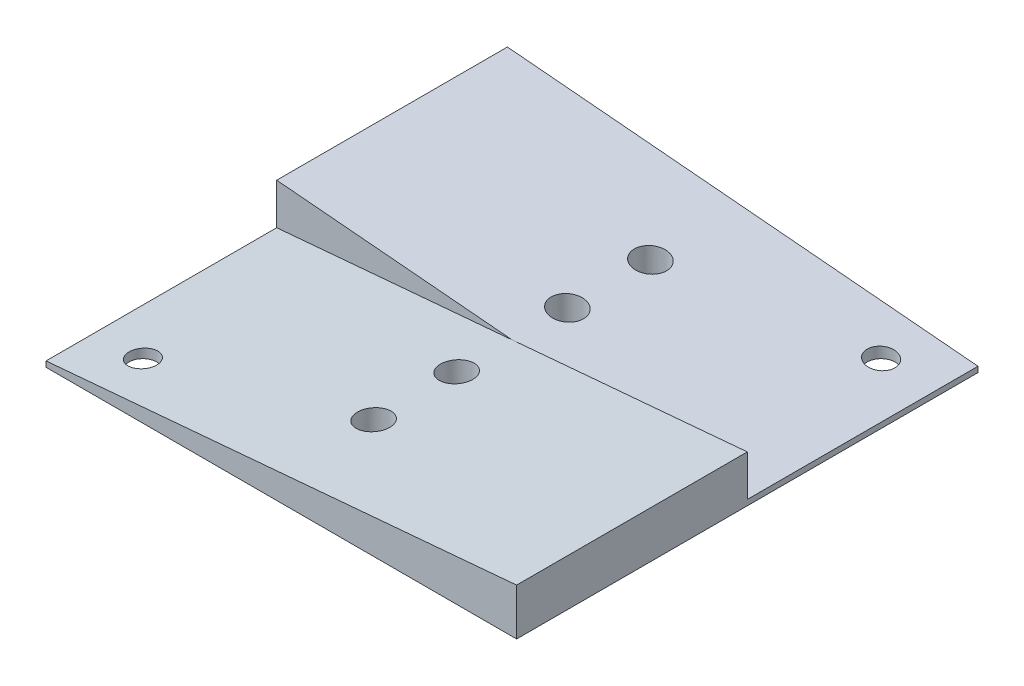
ISO-10303-21;
HEADER;
FILE_DESCRIPTION(('STEP AP214'),'2;1');
FILE_NAME('part.step','',(''),(''),'','','');
FILE_SCHEMA(('AUTOMOTIVE_DESIGN { 1 0 10303 214 1 1 1 1 }'));
ENDSEC;
DATA;
#1=APPLICATION_CONTEXT('core data for automotive mechanical design processes');
#2=APPLICATION_PROTOCOL_DEFINITION('international standard','automotive_design',2000,#1);
#3=PRODUCT_CONTEXT('',#1,'mechanical');
#4=PRODUCT('Part','Part','',(#3));
#5=PRODUCT_RELATED_PRODUCT_CATEGORY('part','',(#4));
#6=PRODUCT_DEFINITION_FORMATION('','',#4);
#7=PRODUCT_DEFINITION_CONTEXT('part definition',#1,'design');
#8=PRODUCT_DEFINITION('design','',#6,#7);
#9=PRODUCT_DEFINITION_SHAPE('','',#8);
#10=(LENGTH_UNIT() NAMED_UNIT(*) SI_UNIT(.MILLI.,.METRE.));
#11=(NAMED_UNIT(*) PLANE_ANGLE_UNIT() SI_UNIT($,.RADIAN.));
#12=(NAMED_UNIT(*) SI_UNIT($,.STERADIAN.) SOLID_ANGLE_UNIT());
#13=UNCERTAINTY_MEASURE_WITH_UNIT(LENGTH_MEASURE(1.E-05),#10,'distance_accuracy_value','');
#14=(GEOMETRIC_REPRESENTATION_CONTEXT(3) GLOBAL_UNCERTAINTY_ASSIGNED_CONTEXT((#13)) GLOBAL_UNIT_ASSIGNED_CONTEXT((#10,
#11,#12)) REPRESENTATION_CONTEXT('',''));
#15=CARTESIAN_POINT('',(0.,0.,0.));
#16=DIRECTION('',(0.,0.,1.));
#17=DIRECTION('',(1.,0.,0.));
#18=AXIS2_PLACEMENT_3D('',#15,#16,#17);
#19=CARTESIAN_POINT('',(-25.5,6.,-25.));
#20=DIRECTION('',(1.,0.,0.));
#21=DIRECTION('',(0.,0.,-1.));
#22=AXIS2_PLACEMENT_3D('',#19,#20,#21);
#23=PLANE('',#22);
#24=DIRECTION('',(0.,-1.,0.));
#25=VECTOR('',#24,1.);
#26=CARTESIAN_POINT('',(-25.5,0.6,0.));
#27=LINE('',#26,#25);
#28=CARTESIAN_POINT('',(-25.5,5.06192183982213,0.));
#29=VERTEX_POINT('',#28);
#30=CARTESIAN_POINT('',(-25.5,0.6,0.));
#31=VERTEX_POINT('',#30);
#32=EDGE_CURVE('E119',#29,#31,#27,.T.);
#33=ORIENTED_EDGE('',*,*,#32,.F.);
#34=DIRECTION('',(0.,0.,-1.));
#35=VECTOR('',#34,1.);
#36=CARTESIAN_POINT('',(-25.5,5.06192183982213,0.));
#37=LINE('',#36,#35);
#38=CARTESIAN_POINT('',(-25.5,5.06192183982213,-25.));
#39=VERTEX_POINT('',#38);
#40=EDGE_CURVE('E53',#29,#39,#37,.T.);
#41=ORIENTED_EDGE('',*,*,#40,.T.);
#42=DIRECTION('',(0.,-1.,0.));
#43=VECTOR('',#42,1.);
#44=CARTESIAN_POINT('',(-25.5,6.,-25.));
#45=LINE('',#44,#43);
#46=CARTESIAN_POINT('',(-25.5,0.,-25.));
#47=VERTEX_POINT('',#46);
#48=EDGE_CURVE('E59',#39,#47,#45,.T.);
#49=ORIENTED_EDGE('',*,*,#48,.T.);
#50=DIRECTION('',(0.,0.,1.));
#51=VECTOR('',#50,1.);
#52=CARTESIAN_POINT('',(-25.5,0.,-25.));
#53=LINE('',#52,#51);
#54=CARTESIAN_POINT('',(-25.5,0.,25.));
#55=VERTEX_POINT('',#54);
#56=EDGE_CURVE('E128',#47,#55,#53,.T.);
#57=ORIENTED_EDGE('',*,*,#56,.T.);
#58=DIRECTION('',(0.,-1.,0.));
#59=VECTOR('',#58,1.);
#60=CARTESIAN_POINT('',(-25.5,6.,25.));
#61=LINE('',#60,#59);
#62=CARTESIAN_POINT('',(-25.5,0.6,25.));
#63=VERTEX_POINT('',#62);
#64=EDGE_CURVE('E45',#63,#55,#61,.T.);
#65=ORIENTED_EDGE('',*,*,#64,.F.);
#66=DIRECTION('',(0.,0.,1.));
#67=VECTOR('',#66,1.);
#68=CARTESIAN_POINT('',(-25.5,0.6,0.));
#69=LINE('',#68,#67);
#70=EDGE_CURVE('E124',#31,#63,#69,.T.);
#71=ORIENTED_EDGE('',*,*,#70,.F.);
#72=EDGE_LOOP('',(#33,#41,#49,#57,#65,#71));
#73=FACE_BOUND('',#72,.T.);
#74=ADVANCED_FACE('F37',(#73),#23,.F.);
#75=CARTESIAN_POINT('',(25.5,6.,25.));
#76=DIRECTION('',(0.,0.,-1.));
#77=DIRECTION('',(-1.,0.,0.));
#78=AXIS2_PLACEMENT_3D('',#75,#76,#77);
#79=PLANE('',#78);
#80=DIRECTION('',(0.,-1.,0.));
#81=VECTOR('',#80,1.);
#82=CARTESIAN_POINT('',(25.5,6.,25.));
#83=LINE('',#82,#81);
#84=CARTESIAN_POINT('',(25.5,5.06192183982213,25.));
#85=VERTEX_POINT('',#84);
#86=CARTESIAN_POINT('',(25.5,0.,25.));
#87=VERTEX_POINT('',#86);
#88=EDGE_CURVE('E140',#85,#87,#83,.T.);
#89=ORIENTED_EDGE('',*,*,#88,.F.);
#90=DIRECTION('',(0.996194698091746,0.0871557427476583,0.));
#91=VECTOR('',#90,1.);
#92=CARTESIAN_POINT('',(-25.5,0.6,25.));
#93=LINE('',#92,#91);
#94=EDGE_CURVE('E115',#63,#85,#93,.T.);
#95=ORIENTED_EDGE('',*,*,#94,.F.);
#96=ORIENTED_EDGE('',*,*,#64,.T.);
#97=DIRECTION('',(1.,0.,0.));
#98=VECTOR('',#97,1.);
#99=CARTESIAN_POINT('',(25.5,0.,25.));
#100=LINE('',#99,#98);
#101=EDGE_CURVE('E131',#55,#87,#100,.T.);
#102=ORIENTED_EDGE('',*,*,#101,.T.);
#103=EDGE_LOOP('',(#89,#95,#96,#102));
#104=FACE_BOUND('',#103,.T.);
#105=ADVANCED_FACE('F193',(#104),#79,.F.);
#106=CARTESIAN_POINT('',(25.5,6.,-25.));
#107=DIRECTION('',(-1.,0.,0.));
#108=DIRECTION('',(0.,0.,1.));
#109=AXIS2_PLACEMENT_3D('',#106,#107,#108);
#110=PLANE('',#109);
#111=DIRECTION('',(0.,-1.,0.));
#112=VECTOR('',#111,1.);
#113=CARTESIAN_POINT('',(25.5,6.,-25.));
#114=LINE('',#113,#112);
#115=CARTESIAN_POINT('',(25.5,0.6,-25.));
#116=VERTEX_POINT('',#115);
#117=CARTESIAN_POINT('',(25.5,0.,-25.));
#118=VERTEX_POINT('',#117);
#119=EDGE_CURVE('E113',#116,#118,#114,.T.);
#120=ORIENTED_EDGE('',*,*,#119,.F.);
#121=DIRECTION('',(0.,0.,-1.));
#122=VECTOR('',#121,1.);
#123=CARTESIAN_POINT('',(25.5,0.6,0.));
#124=LINE('',#123,#122);
#125=CARTESIAN_POINT('',(25.5,0.6,0.));
#126=VERTEX_POINT('',#125);
#127=EDGE_CURVE('E107',#126,#116,#124,.T.);
#128=ORIENTED_EDGE('',*,*,#127,.F.);
#129=DIRECTION('',(0.,-1.,0.));
#130=VECTOR('',#129,1.);
#131=CARTESIAN_POINT('',(25.5,0.6,0.));
#132=LINE('',#131,#130);
#133=CARTESIAN_POINT('',(25.5,5.06192183982213,0.));
#134=VERTEX_POINT('',#133);
#135=EDGE_CURVE('E94',#134,#126,#132,.T.);
#136=ORIENTED_EDGE('',*,*,#135,.F.);
#137=DIRECTION('',(0.,0.,1.));
#138=VECTOR('',#137,1.);
#139=CARTESIAN_POINT('',(25.5,5.06192183982213,0.));
#140=LINE('',#139,#138);
#141=EDGE_CURVE('E126',#134,#85,#140,.T.);
#142=ORIENTED_EDGE('',*,*,#141,.T.);
#143=ORIENTED_EDGE('',*,*,#88,.T.);
#144=DIRECTION('',(0.,0.,-1.));
#145=VECTOR('',#144,1.);
#146=CARTESIAN_POINT('',(25.5,0.,-25.));
#147=LINE('',#146,#145);
#148=EDGE_CURVE('E134',#87,#118,#147,.T.);
#149=ORIENTED_EDGE('',*,*,#148,.T.);
#150=EDGE_LOOP('',(#120,#128,#136,#142,#143,#149));
#151=FACE_BOUND('',#150,.T.);
#152=ADVANCED_FACE('F111',(#151),#110,.F.);
#153=CARTESIAN_POINT('',(25.5,6.,-25.));
#154=DIRECTION('',(0.,0.,1.));
#155=DIRECTION('',(1.,0.,0.));
#156=AXIS2_PLACEMENT_3D('',#153,#154,#155);
#157=PLANE('',#156);
#158=ORIENTED_EDGE('',*,*,#48,.F.);
#159=DIRECTION('',(-0.996194698091746,0.0871557427476583,0.));
#160=VECTOR('',#159,1.);
#161=CARTESIAN_POINT('',(25.5,0.6,-25.));
#162=LINE('',#161,#160);
#163=EDGE_CURVE('E104',#116,#39,#162,.T.);
#164=ORIENTED_EDGE('',*,*,#163,.F.);
#165=ORIENTED_EDGE('',*,*,#119,.T.);
#166=DIRECTION('',(-1.,0.,0.));
#167=VECTOR('',#166,1.);
#168=CARTESIAN_POINT('',(25.5,0.,-25.));
#169=LINE('',#168,#167);
#170=EDGE_CURVE('E136',#118,#47,#169,.T.);
#171=ORIENTED_EDGE('',*,*,#170,.T.);
#172=EDGE_LOOP('',(#158,#164,#165,#171));
#173=FACE_BOUND('',#172,.T.);
#174=ADVANCED_FACE('F182',(#173),#157,.F.);
#175=CARTESIAN_POINT('',(0.,0.,0.));
#176=DIRECTION('',(0.,-1.,0.));
#177=DIRECTION('',(0.,0.,-1.));
#178=AXIS2_PLACEMENT_3D('',#175,#176,#177);
#179=PLANE('',#178);
#180=CARTESIAN_POINT('',(-20.,0.,20.));
#181=DIRECTION('',(0.,-1.,0.));
#182=DIRECTION('',(0.,0.,-1.));
#183=AXIS2_PLACEMENT_3D('',#180,#181,#182);
#184=CIRCLE('',#183,1.5);
#185=CARTESIAN_POINT('',(-20.,0.,18.5));
#186=VERTEX_POINT('',#185);
#187=EDGE_CURVE('E157',#186,#186,#184,.T.);
#188=ORIENTED_EDGE('',*,*,#187,.F.);
#189=EDGE_LOOP('',(#188));
#190=FACE_BOUND('',#189,.T.);
#191=CARTESIAN_POINT('',(20.,0.,-20.));
#192=DIRECTION('',(0.,-1.,0.));
#193=DIRECTION('',(0.,0.,-1.));
#194=AXIS2_PLACEMENT_3D('',#191,#192,#193);
#195=CIRCLE('',#194,1.5);
#196=CARTESIAN_POINT('',(20.,0.,-21.5));
#197=VERTEX_POINT('',#196);
#198=EDGE_CURVE('E163',#197,#197,#195,.T.);
#199=ORIENTED_EDGE('',*,*,#198,.F.);
#200=EDGE_LOOP('',(#199));
#201=FACE_BOUND('',#200,.T.);
#202=CARTESIAN_POINT('',(0.,0.,15.));
#203=DIRECTION('',(0.,-1.,0.));
#204=DIRECTION('',(0.,0.,-1.));
#205=AXIS2_PLACEMENT_3D('',#202,#203,#204);
#206=CIRCLE('',#205,1.75);
#207=CARTESIAN_POINT('',(0.,0.,13.25));
#208=VERTEX_POINT('',#207);
#209=EDGE_CURVE('E173',#208,#208,#206,.T.);
#210=ORIENTED_EDGE('',*,*,#209,.F.);
#211=EDGE_LOOP('',(#210));
#212=FACE_BOUND('',#211,.T.);
#213=CARTESIAN_POINT('',(0.,0.,-15.));
#214=DIRECTION('',(0.,-1.,0.));
#215=DIRECTION('',(0.,0.,-1.));
#216=AXIS2_PLACEMENT_3D('',#213,#214,#215);
#217=CIRCLE('',#216,1.75);
#218=CARTESIAN_POINT('',(0.,0.,-16.75));
#219=VERTEX_POINT('',#218);
#220=EDGE_CURVE('E172',#219,#219,#217,.T.);
#221=ORIENTED_EDGE('',*,*,#220,.F.);
#222=EDGE_LOOP('',(#221));
#223=FACE_BOUND('',#222,.T.);
#224=CARTESIAN_POINT('',(0.,0.,-6.));
#225=DIRECTION('',(0.,-1.,0.));
#226=DIRECTION('',(0.,0.,-1.));
#227=AXIS2_PLACEMENT_3D('',#224,#225,#226);
#228=CIRCLE('',#227,1.75);
#229=CARTESIAN_POINT('',(0.,0.,-7.75));
#230=VERTEX_POINT('',#229);
#231=EDGE_CURVE('E161',#230,#230,#228,.T.);
#232=ORIENTED_EDGE('',*,*,#231,.F.);
#233=EDGE_LOOP('',(#232));
#234=FACE_BOUND('',#233,.T.);
#235=CARTESIAN_POINT('',(0.,0.,6.));
#236=DIRECTION('',(0.,-1.,0.));
#237=DIRECTION('',(0.,0.,-1.));
#238=AXIS2_PLACEMENT_3D('',#235,#236,#237);
#239=CIRCLE('',#238,1.75);
#240=CARTESIAN_POINT('',(0.,0.,4.25));
#241=VERTEX_POINT('',#240);
#242=EDGE_CURVE('E147',#241,#241,#239,.T.);
#243=ORIENTED_EDGE('',*,*,#242,.F.);
#244=EDGE_LOOP('',(#243));
#245=FACE_BOUND('',#244,.T.);
#246=ORIENTED_EDGE('',*,*,#56,.F.);
#247=ORIENTED_EDGE('',*,*,#170,.F.);
#248=ORIENTED_EDGE('',*,*,#148,.F.);
#249=ORIENTED_EDGE('',*,*,#101,.F.);
#250=EDGE_LOOP('',(#246,#247,#248,#249));
#251=FACE_BOUND('',#250,.T.);
#252=ADVANCED_FACE('F188',(#190,#201,#212,#223,#234,#245,#251),#179,.T.);
#253=CARTESIAN_POINT('',(-25.5,0.6,0.));
#254=DIRECTION('',(0.0871557427476583,-0.996194698091746,0.));
#255=DIRECTION('',(0.996194698091746,0.0871557427476583,0.));
#256=AXIS2_PLACEMENT_3D('',#253,#254,#255);
#257=PLANE('',#256);
#258=CARTESIAN_POINT('',(-20.,1.08118764939258,20.));
#259=DIRECTION('',(0.0871557427476583,-0.996194698091746,0.));
#260=DIRECTION('',(-0.996194698091746,-0.0871557427476583,0.));
#261=AXIS2_PLACEMENT_3D('',#258,#259,#260);
#262=ELLIPSE('',#261,1.50572975631502,1.5);
#263=CARTESIAN_POINT('',(-21.5,0.949954654103696,20.));
#264=VERTEX_POINT('',#263);
#265=EDGE_CURVE('E40',#264,#264,#262,.T.);
#266=ORIENTED_EDGE('',*,*,#265,.T.);
#267=EDGE_LOOP('',(#266));
#268=FACE_BOUND('',#267,.T.);
#269=CARTESIAN_POINT('',(0.,2.83096091991106,15.));
#270=DIRECTION('',(0.0871557427476583,-0.996194698091746,0.));
#271=DIRECTION('',(-0.996194698091746,-0.0871557427476583,0.));
#272=AXIS2_PLACEMENT_3D('',#269,#270,#271);
#273=ELLIPSE('',#272,1.75668471570086,1.75);
#274=CARTESIAN_POINT('',(-1.75,2.6778557587407,15.));
#275=VERTEX_POINT('',#274);
#276=EDGE_CURVE('E153',#275,#275,#273,.T.);
#277=ORIENTED_EDGE('',*,*,#276,.T.);
#278=EDGE_LOOP('',(#277));
#279=FACE_BOUND('',#278,.T.);
#280=CARTESIAN_POINT('',(0.,2.83096091991106,6.));
#281=DIRECTION('',(0.0871557427476583,-0.996194698091746,0.));
#282=DIRECTION('',(-0.996194698091746,-0.0871557427476583,0.));
#283=AXIS2_PLACEMENT_3D('',#280,#281,#282);
#284=ELLIPSE('',#283,1.75668471570086,1.75);
#285=CARTESIAN_POINT('',(-1.75,2.6778557587407,6.));
#286=VERTEX_POINT('',#285);
#287=EDGE_CURVE('E150',#286,#286,#284,.T.);
#288=ORIENTED_EDGE('',*,*,#287,.T.);
#289=EDGE_LOOP('',(#288));
#290=FACE_BOUND('',#289,.T.);
#291=ORIENTED_EDGE('',*,*,#94,.T.);
#292=ORIENTED_EDGE('',*,*,#141,.F.);
#293=DIRECTION('',(0.996194698091746,0.0871557427476583,0.));
#294=VECTOR('',#293,1.);
#295=CARTESIAN_POINT('',(-25.5,0.6,0.));
#296=LINE('',#295,#294);
#297=CARTESIAN_POINT('',(-3.01841884819964E-13,2.83096091991109,0.));
#298=VERTEX_POINT('',#297);
#299=EDGE_CURVE('E99',#298,#134,#296,.T.);
#300=ORIENTED_EDGE('',*,*,#299,.F.);
#301=EDGE_CURVE('E121',#31,#298,#296,.T.);
#302=ORIENTED_EDGE('',*,*,#301,.F.);
#303=ORIENTED_EDGE('',*,*,#70,.T.);
#304=EDGE_LOOP('',(#291,#292,#300,#302,#303));
#305=FACE_BOUND('',#304,.T.);
#306=ADVANCED_FACE('F195',(#268,#279,#290,#305),#257,.F.);
#307=CARTESIAN_POINT('',(0.,0.,0.));
#308=DIRECTION('',(0.,0.,-1.));
#309=DIRECTION('',(-1.,0.,0.));
#310=AXIS2_PLACEMENT_3D('',#307,#308,#309);
#311=PLANE('',#310);
#312=ORIENTED_EDGE('',*,*,#301,.T.);
#313=DIRECTION('',(-0.996194698091746,0.0871557427476583,0.));
#314=VECTOR('',#313,1.);
#315=CARTESIAN_POINT('',(0.245795602394427,2.80945659115703,0.));
#316=LINE('',#315,#314);
#317=EDGE_CURVE('E11',#298,#29,#316,.T.);
#318=ORIENTED_EDGE('',*,*,#317,.T.);
#319=ORIENTED_EDGE('',*,*,#32,.T.);
#320=EDGE_LOOP('',(#312,#318,#319));
#321=FACE_BOUND('',#320,.T.);
#322=ADVANCED_FACE('F198',(#321),#311,.F.);
#323=CARTESIAN_POINT('',(0.,0.,0.));
#324=DIRECTION('',(0.,0.,1.));
#325=DIRECTION('',(1.,0.,0.));
#326=AXIS2_PLACEMENT_3D('',#323,#324,#325);
#327=PLANE('',#326);
#328=ORIENTED_EDGE('',*,*,#135,.T.);
#329=DIRECTION('',(-0.996194698091746,0.0871557427476583,0.));
#330=VECTOR('',#329,1.);
#331=CARTESIAN_POINT('',(25.5,0.6,0.));
#332=LINE('',#331,#330);
#333=EDGE_CURVE('E97',#126,#298,#332,.T.);
#334=ORIENTED_EDGE('',*,*,#333,.T.);
#335=ORIENTED_EDGE('',*,*,#299,.T.);
#336=EDGE_LOOP('',(#328,#334,#335));
#337=FACE_BOUND('',#336,.T.);
#338=ADVANCED_FACE('F96',(#337),#327,.F.);
#339=CARTESIAN_POINT('',(25.5,0.6,0.));
#340=DIRECTION('',(-0.0871557427476583,-0.996194698091746,0.));
#341=DIRECTION('',(0.996194698091746,-0.0871557427476583,0.));
#342=AXIS2_PLACEMENT_3D('',#339,#340,#341);
#343=PLANE('',#342);
#344=CARTESIAN_POINT('',(20.,1.08118764939258,-20.));
#345=DIRECTION('',(-0.0871557427476583,-0.996194698091746,0.));
#346=DIRECTION('',(0.996194698091746,-0.0871557427476583,0.));
#347=AXIS2_PLACEMENT_3D('',#344,#345,#346);
#348=ELLIPSE('',#347,1.50572975631502,1.5);
#349=CARTESIAN_POINT('',(21.5,0.949954654103696,-20.));
#350=VERTEX_POINT('',#349);
#351=EDGE_CURVE('E155',#350,#350,#348,.T.);
#352=ORIENTED_EDGE('',*,*,#351,.T.);
#353=EDGE_LOOP('',(#352));
#354=FACE_BOUND('',#353,.T.);
#355=CARTESIAN_POINT('',(0.,2.83096091991107,-15.));
#356=DIRECTION('',(-0.0871557427476583,-0.996194698091746,0.));
#357=DIRECTION('',(0.996194698091746,-0.0871557427476583,0.));
#358=AXIS2_PLACEMENT_3D('',#355,#356,#357);
#359=ELLIPSE('',#358,1.75668471570086,1.75);
#360=CARTESIAN_POINT('',(1.75,2.6778557587407,-15.));
#361=VERTEX_POINT('',#360);
#362=EDGE_CURVE('E146',#361,#361,#359,.T.);
#363=ORIENTED_EDGE('',*,*,#362,.T.);
#364=EDGE_LOOP('',(#363));
#365=FACE_BOUND('',#364,.T.);
#366=CARTESIAN_POINT('',(0.,2.83096091991107,-6.));
#367=DIRECTION('',(-0.0871557427476583,-0.996194698091746,0.));
#368=DIRECTION('',(0.996194698091746,-0.0871557427476583,0.));
#369=AXIS2_PLACEMENT_3D('',#366,#367,#368);
#370=ELLIPSE('',#369,1.75668471570086,1.75);
#371=CARTESIAN_POINT('',(1.75,2.6778557587407,-6.));
#372=VERTEX_POINT('',#371);
#373=EDGE_CURVE('E143',#372,#372,#370,.T.);
#374=ORIENTED_EDGE('',*,*,#373,.T.);
#375=EDGE_LOOP('',(#374));
#376=FACE_BOUND('',#375,.T.);
#377=ORIENTED_EDGE('',*,*,#163,.T.);
#378=ORIENTED_EDGE('',*,*,#40,.F.);
#379=ORIENTED_EDGE('',*,*,#317,.F.);
#380=ORIENTED_EDGE('',*,*,#333,.F.);
#381=ORIENTED_EDGE('',*,*,#127,.T.);
#382=EDGE_LOOP('',(#377,#378,#379,#380,#381));
#383=FACE_BOUND('',#382,.T.);
#384=ADVANCED_FACE('F106',(#354,#365,#376,#383),#343,.F.);
#385=CARTESIAN_POINT('',(0.,5.06192183982213,-6.));
#386=DIRECTION('',(0.,-1.,0.));
#387=DIRECTION('',(0.,0.,-1.));
#388=AXIS2_PLACEMENT_3D('',#385,#386,#387);
#389=CYLINDRICAL_SURFACE('',#388,1.75);
#390=ORIENTED_EDGE('',*,*,#231,.T.);
#391=EDGE_LOOP('',(#390));
#392=FACE_BOUND('',#391,.T.);
#393=ORIENTED_EDGE('',*,*,#373,.F.);
#394=EDGE_LOOP('',(#393));
#395=FACE_BOUND('',#394,.T.);
#396=ADVANCED_FACE('F252',(#392,#395),#389,.F.);
#397=CARTESIAN_POINT('',(0.,5.06192183982213,-15.));
#398=DIRECTION('',(0.,-1.,0.));
#399=DIRECTION('',(0.,0.,-1.));
#400=AXIS2_PLACEMENT_3D('',#397,#398,#399);
#401=CYLINDRICAL_SURFACE('',#400,1.75);
#402=ORIENTED_EDGE('',*,*,#220,.T.);
#403=EDGE_LOOP('',(#402));
#404=FACE_BOUND('',#403,.T.);
#405=ORIENTED_EDGE('',*,*,#362,.F.);
#406=EDGE_LOOP('',(#405));
#407=FACE_BOUND('',#406,.T.);
#408=ADVANCED_FACE('F241',(#404,#407),#401,.F.);
#409=CARTESIAN_POINT('',(0.,5.06192183982213,6.));
#410=DIRECTION('',(0.,-1.,0.));
#411=DIRECTION('',(0.,0.,-1.));
#412=AXIS2_PLACEMENT_3D('',#409,#410,#411);
#413=CYLINDRICAL_SURFACE('',#412,1.75);
#414=ORIENTED_EDGE('',*,*,#242,.T.);
#415=EDGE_LOOP('',(#414));
#416=FACE_BOUND('',#415,.T.);
#417=ORIENTED_EDGE('',*,*,#287,.F.);
#418=EDGE_LOOP('',(#417));
#419=FACE_BOUND('',#418,.T.);
#420=ADVANCED_FACE('F237',(#416,#419),#413,.F.);
#421=CARTESIAN_POINT('',(0.,5.06192183982213,15.));
#422=DIRECTION('',(0.,-1.,0.));
#423=DIRECTION('',(0.,0.,-1.));
#424=AXIS2_PLACEMENT_3D('',#421,#422,#423);
#425=CYLINDRICAL_SURFACE('',#424,1.75);
#426=ORIENTED_EDGE('',*,*,#209,.T.);
#427=EDGE_LOOP('',(#426));
#428=FACE_BOUND('',#427,.T.);
#429=ORIENTED_EDGE('',*,*,#276,.F.);
#430=EDGE_LOOP('',(#429));
#431=FACE_BOUND('',#430,.T.);
#432=ADVANCED_FACE('F240',(#428,#431),#425,.F.);
#433=CARTESIAN_POINT('',(20.,5.06192183982213,-20.));
#434=DIRECTION('',(0.,-1.,0.));
#435=DIRECTION('',(0.,0.,-1.));
#436=AXIS2_PLACEMENT_3D('',#433,#434,#435);
#437=CYLINDRICAL_SURFACE('',#436,1.5);
#438=ORIENTED_EDGE('',*,*,#198,.T.);
#439=EDGE_LOOP('',(#438));
#440=FACE_BOUND('',#439,.T.);
#441=ORIENTED_EDGE('',*,*,#351,.F.);
#442=EDGE_LOOP('',(#441));
#443=FACE_BOUND('',#442,.T.);
#444=ADVANCED_FACE('F249',(#440,#443),#437,.F.);
#445=CARTESIAN_POINT('',(-20.,5.06192183982213,20.));
#446=DIRECTION('',(0.,-1.,0.));
#447=DIRECTION('',(0.,0.,-1.));
#448=AXIS2_PLACEMENT_3D('',#445,#446,#447);
#449=CYLINDRICAL_SURFACE('',#448,1.5);
#450=ORIENTED_EDGE('',*,*,#187,.T.);
#451=EDGE_LOOP('',(#450));
#452=FACE_BOUND('',#451,.T.);
#453=ORIENTED_EDGE('',*,*,#265,.F.);
#454=EDGE_LOOP('',(#453));
#455=FACE_BOUND('',#454,.T.);
#456=ADVANCED_FACE('F273',(#452,#455),#449,.F.);
#457=CLOSED_SHELL('',(#74,#105,#152,#174,#252,#306,#322,#338,#384,#396,#408,#420,#432,#444,#456));
#458=MANIFOLD_SOLID_BREP('B2',#457);
#459=ADVANCED_BREP_SHAPE_REPRESENTATION('',(#18,#458),#14);
#460=SHAPE_DEFINITION_REPRESENTATION(#9,#459);
ENDSEC;
END-ISO-10303-21;
